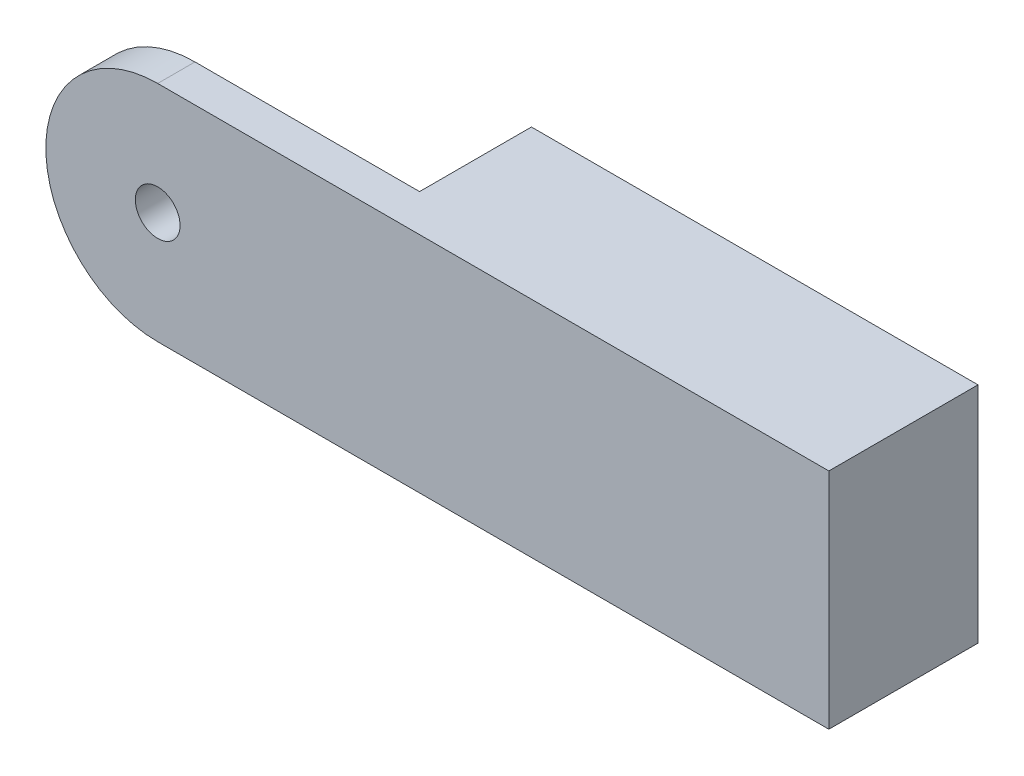
ISO-10303-21;
HEADER;
FILE_DESCRIPTION(('STEP AP214'),'2;1');
FILE_NAME('part.step','',(''),(''),'','','');
FILE_SCHEMA(('AUTOMOTIVE_DESIGN { 1 0 10303 214 1 1 1 1 }'));
ENDSEC;
DATA;
#1=APPLICATION_CONTEXT('core data for automotive mechanical design processes');
#2=APPLICATION_PROTOCOL_DEFINITION('international standard','automotive_design',2000,#1);
#3=PRODUCT_CONTEXT('',#1,'mechanical');
#4=PRODUCT('Part','Part','',(#3));
#5=PRODUCT_RELATED_PRODUCT_CATEGORY('part','',(#4));
#6=PRODUCT_DEFINITION_FORMATION('','',#4);
#7=PRODUCT_DEFINITION_CONTEXT('part definition',#1,'design');
#8=PRODUCT_DEFINITION('design','',#6,#7);
#9=PRODUCT_DEFINITION_SHAPE('','',#8);
#10=(LENGTH_UNIT() NAMED_UNIT(*) SI_UNIT(.MILLI.,.METRE.));
#11=(NAMED_UNIT(*) PLANE_ANGLE_UNIT() SI_UNIT($,.RADIAN.));
#12=(NAMED_UNIT(*) SI_UNIT($,.STERADIAN.) SOLID_ANGLE_UNIT());
#13=UNCERTAINTY_MEASURE_WITH_UNIT(LENGTH_MEASURE(1.E-05),#10,'distance_accuracy_value','');
#14=(GEOMETRIC_REPRESENTATION_CONTEXT(3) GLOBAL_UNCERTAINTY_ASSIGNED_CONTEXT((#13)) GLOBAL_UNIT_ASSIGNED_CONTEXT((#10,
#11,#12)) REPRESENTATION_CONTEXT('',''));
#15=CARTESIAN_POINT('',(0.,0.,0.));
#16=DIRECTION('',(0.,0.,1.));
#17=DIRECTION('',(1.,0.,0.));
#18=AXIS2_PLACEMENT_3D('',#15,#16,#17);
#19=CARTESIAN_POINT('',(-45.,0.,20.));
#20=DIRECTION('',(0.,0.,-1.));
#21=DIRECTION('',(-1.,0.,0.));
#22=AXIS2_PLACEMENT_3D('',#19,#20,#21);
#23=CYLINDRICAL_SURFACE('',#22,15.);
#24=CARTESIAN_POINT('',(-45.,0.,15.));
#25=DIRECTION('',(0.,0.,-1.));
#26=DIRECTION('',(-1.,0.,0.));
#27=AXIS2_PLACEMENT_3D('',#24,#25,#26);
#28=CIRCLE('',#27,15.);
#29=CARTESIAN_POINT('',(-45.,-15.,15.));
#30=VERTEX_POINT('',#29);
#31=CARTESIAN_POINT('',(-45.,15.,15.));
#32=VERTEX_POINT('',#31);
#33=EDGE_CURVE('E130',#30,#32,#28,.T.);
#34=ORIENTED_EDGE('',*,*,#33,.F.);
#35=DIRECTION('',(0.,0.,-1.));
#36=VECTOR('',#35,1.);
#37=CARTESIAN_POINT('',(-45.,-15.,20.));
#38=LINE('',#37,#36);
#39=CARTESIAN_POINT('',(-45.,-15.,20.));
#40=VERTEX_POINT('',#39);
#41=EDGE_CURVE('E103',#40,#30,#38,.T.);
#42=ORIENTED_EDGE('',*,*,#41,.F.);
#43=CARTESIAN_POINT('',(-45.,0.,20.));
#44=DIRECTION('',(0.,0.,1.));
#45=DIRECTION('',(1.,0.,0.));
#46=AXIS2_PLACEMENT_3D('',#43,#44,#45);
#47=CIRCLE('',#46,15.);
#48=CARTESIAN_POINT('',(-45.,15.,20.));
#49=VERTEX_POINT('',#48);
#50=EDGE_CURVE('E89',#49,#40,#47,.T.);
#51=ORIENTED_EDGE('',*,*,#50,.F.);
#52=DIRECTION('',(0.,0.,-1.));
#53=VECTOR('',#52,1.);
#54=CARTESIAN_POINT('',(-45.,15.,20.));
#55=LINE('',#54,#53);
#56=EDGE_CURVE('E46',#49,#32,#55,.T.);
#57=ORIENTED_EDGE('',*,*,#56,.T.);
#58=EDGE_LOOP('',(#34,#42,#51,#57));
#59=FACE_BOUND('',#58,.T.);
#60=ADVANCED_FACE('F36',(#59),#23,.T.);
#61=CARTESIAN_POINT('',(-45.,0.,20.));
#62=DIRECTION('',(0.,0.,-1.));
#63=DIRECTION('',(-1.,0.,0.));
#64=AXIS2_PLACEMENT_3D('',#61,#62,#63);
#65=CYLINDRICAL_SURFACE('',#64,3.);
#66=CARTESIAN_POINT('',(-45.,0.,20.));
#67=DIRECTION('',(0.,0.,1.));
#68=DIRECTION('',(1.,0.,0.));
#69=AXIS2_PLACEMENT_3D('',#66,#67,#68);
#70=CIRCLE('',#69,3.);
#71=CARTESIAN_POINT('',(-42.,0.,20.));
#72=VERTEX_POINT('',#71);
#73=EDGE_CURVE('E114',#72,#72,#70,.T.);
#74=ORIENTED_EDGE('',*,*,#73,.T.);
#75=EDGE_LOOP('',(#74));
#76=FACE_BOUND('',#75,.T.);
#77=CARTESIAN_POINT('',(-45.,0.,15.));
#78=DIRECTION('',(0.,0.,-1.));
#79=DIRECTION('',(-1.,0.,0.));
#80=AXIS2_PLACEMENT_3D('',#77,#78,#79);
#81=CIRCLE('',#80,3.);
#82=CARTESIAN_POINT('',(-48.,0.,15.));
#83=VERTEX_POINT('',#82);
#84=EDGE_CURVE('E40',#83,#83,#81,.T.);
#85=ORIENTED_EDGE('',*,*,#84,.T.);
#86=EDGE_LOOP('',(#85));
#87=FACE_BOUND('',#86,.T.);
#88=ADVANCED_FACE('F159',(#76,#87),#65,.F.);
#89=CARTESIAN_POINT('',(-45.,0.,20.));
#90=DIRECTION('',(0.,0.,1.));
#91=DIRECTION('',(1.,0.,0.));
#92=AXIS2_PLACEMENT_3D('',#89,#90,#91);
#93=PLANE('',#92);
#94=DIRECTION('',(0.,1.,0.));
#95=VECTOR('',#94,1.);
#96=CARTESIAN_POINT('',(45.,15.,20.));
#97=LINE('',#96,#95);
#98=CARTESIAN_POINT('',(45.,-15.,20.));
#99=VERTEX_POINT('',#98);
#100=CARTESIAN_POINT('',(45.,15.,20.));
#101=VERTEX_POINT('',#100);
#102=EDGE_CURVE('E92',#99,#101,#97,.T.);
#103=ORIENTED_EDGE('',*,*,#102,.T.);
#104=DIRECTION('',(-1.,0.,0.));
#105=VECTOR('',#104,1.);
#106=CARTESIAN_POINT('',(-45.,15.,20.));
#107=LINE('',#106,#105);
#108=EDGE_CURVE('E84',#101,#49,#107,.T.);
#109=ORIENTED_EDGE('',*,*,#108,.T.);
#110=ORIENTED_EDGE('',*,*,#50,.T.);
#111=DIRECTION('',(1.,0.,0.));
#112=VECTOR('',#111,1.);
#113=CARTESIAN_POINT('',(-45.,-15.,20.));
#114=LINE('',#113,#112);
#115=EDGE_CURVE('E54',#40,#99,#114,.T.);
#116=ORIENTED_EDGE('',*,*,#115,.T.);
#117=EDGE_LOOP('',(#103,#109,#110,#116));
#118=FACE_BOUND('',#117,.T.);
#119=ORIENTED_EDGE('',*,*,#73,.F.);
#120=EDGE_LOOP('',(#119));
#121=FACE_BOUND('',#120,.T.);
#122=ADVANCED_FACE('F86',(#118,#121),#93,.T.);
#123=CARTESIAN_POINT('',(-45.,0.,0.));
#124=DIRECTION('',(0.,0.,1.));
#125=DIRECTION('',(1.,0.,0.));
#126=AXIS2_PLACEMENT_3D('',#123,#124,#125);
#127=PLANE('',#126);
#128=DIRECTION('',(1.,0.,0.));
#129=VECTOR('',#128,1.);
#130=CARTESIAN_POINT('',(-45.,-15.,0.));
#131=LINE('',#130,#129);
#132=CARTESIAN_POINT('',(-14.8840247808136,-15.,0.));
#133=VERTEX_POINT('',#132);
#134=CARTESIAN_POINT('',(45.,-15.,0.));
#135=VERTEX_POINT('',#134);
#136=EDGE_CURVE('E116',#133,#135,#131,.T.);
#137=ORIENTED_EDGE('',*,*,#136,.F.);
#138=DIRECTION('',(0.,1.,0.));
#139=VECTOR('',#138,1.);
#140=CARTESIAN_POINT('',(-14.8840247808136,15.,0.));
#141=LINE('',#140,#139);
#142=CARTESIAN_POINT('',(-14.8840247808136,15.,0.));
#143=VERTEX_POINT('',#142);
#144=EDGE_CURVE('E137',#133,#143,#141,.T.);
#145=ORIENTED_EDGE('',*,*,#144,.T.);
#146=DIRECTION('',(-1.,0.,0.));
#147=VECTOR('',#146,1.);
#148=CARTESIAN_POINT('',(-45.,15.,0.));
#149=LINE('',#148,#147);
#150=CARTESIAN_POINT('',(45.,15.,0.));
#151=VERTEX_POINT('',#150);
#152=EDGE_CURVE('E66',#151,#143,#149,.T.);
#153=ORIENTED_EDGE('',*,*,#152,.F.);
#154=DIRECTION('',(0.,1.,0.));
#155=VECTOR('',#154,1.);
#156=CARTESIAN_POINT('',(45.,15.,0.));
#157=LINE('',#156,#155);
#158=EDGE_CURVE('E111',#135,#151,#157,.T.);
#159=ORIENTED_EDGE('',*,*,#158,.F.);
#160=EDGE_LOOP('',(#137,#145,#153,#159));
#161=FACE_BOUND('',#160,.T.);
#162=ADVANCED_FACE('F144',(#161),#127,.F.);
#163=CARTESIAN_POINT('',(45.,15.,20.));
#164=DIRECTION('',(-1.,0.,0.));
#165=DIRECTION('',(0.,0.,1.));
#166=AXIS2_PLACEMENT_3D('',#163,#164,#165);
#167=PLANE('',#166);
#168=ORIENTED_EDGE('',*,*,#158,.T.);
#169=DIRECTION('',(0.,0.,-1.));
#170=VECTOR('',#169,1.);
#171=CARTESIAN_POINT('',(45.,15.,20.));
#172=LINE('',#171,#170);
#173=EDGE_CURVE('E11',#101,#151,#172,.T.);
#174=ORIENTED_EDGE('',*,*,#173,.F.);
#175=ORIENTED_EDGE('',*,*,#102,.F.);
#176=DIRECTION('',(0.,0.,-1.));
#177=VECTOR('',#176,1.);
#178=CARTESIAN_POINT('',(45.,-15.,20.));
#179=LINE('',#178,#177);
#180=EDGE_CURVE('E107',#99,#135,#179,.T.);
#181=ORIENTED_EDGE('',*,*,#180,.T.);
#182=EDGE_LOOP('',(#168,#174,#175,#181));
#183=FACE_BOUND('',#182,.T.);
#184=ADVANCED_FACE('F38',(#183),#167,.F.);
#185=CARTESIAN_POINT('',(-45.,15.,20.));
#186=DIRECTION('',(0.,-1.,0.));
#187=DIRECTION('',(0.,0.,-1.));
#188=AXIS2_PLACEMENT_3D('',#185,#186,#187);
#189=PLANE('',#188);
#190=ORIENTED_EDGE('',*,*,#152,.T.);
#191=DIRECTION('',(0.,0.,1.));
#192=VECTOR('',#191,1.);
#193=CARTESIAN_POINT('',(-14.8840247808136,15.,0.));
#194=LINE('',#193,#192);
#195=CARTESIAN_POINT('',(-14.8840247808136,15.,15.));
#196=VERTEX_POINT('',#195);
#197=EDGE_CURVE('E135',#143,#196,#194,.T.);
#198=ORIENTED_EDGE('',*,*,#197,.T.);
#199=DIRECTION('',(-1.,0.,0.));
#200=VECTOR('',#199,1.);
#201=CARTESIAN_POINT('',(-29.6441469032038,15.,15.));
#202=LINE('',#201,#200);
#203=EDGE_CURVE('E101',#196,#32,#202,.T.);
#204=ORIENTED_EDGE('',*,*,#203,.T.);
#205=ORIENTED_EDGE('',*,*,#56,.F.);
#206=ORIENTED_EDGE('',*,*,#108,.F.);
#207=ORIENTED_EDGE('',*,*,#173,.T.);
#208=EDGE_LOOP('',(#190,#198,#204,#205,#206,#207));
#209=FACE_BOUND('',#208,.T.);
#210=ADVANCED_FACE('F98',(#209),#189,.F.);
#211=CARTESIAN_POINT('',(-45.,-15.,20.));
#212=DIRECTION('',(0.,1.,0.));
#213=DIRECTION('',(0.,0.,1.));
#214=AXIS2_PLACEMENT_3D('',#211,#212,#213);
#215=PLANE('',#214);
#216=DIRECTION('',(1.,0.,0.));
#217=VECTOR('',#216,1.);
#218=CARTESIAN_POINT('',(-29.6441469032038,-15.,15.));
#219=LINE('',#218,#217);
#220=CARTESIAN_POINT('',(-14.8840247808136,-15.,15.));
#221=VERTEX_POINT('',#220);
#222=EDGE_CURVE('E76',#30,#221,#219,.T.);
#223=ORIENTED_EDGE('',*,*,#222,.T.);
#224=DIRECTION('',(0.,0.,1.));
#225=VECTOR('',#224,1.);
#226=CARTESIAN_POINT('',(-14.8840247808136,-15.,0.));
#227=LINE('',#226,#225);
#228=EDGE_CURVE('E134',#133,#221,#227,.T.);
#229=ORIENTED_EDGE('',*,*,#228,.F.);
#230=ORIENTED_EDGE('',*,*,#136,.T.);
#231=ORIENTED_EDGE('',*,*,#180,.F.);
#232=ORIENTED_EDGE('',*,*,#115,.F.);
#233=ORIENTED_EDGE('',*,*,#41,.T.);
#234=EDGE_LOOP('',(#223,#229,#230,#231,#232,#233));
#235=FACE_BOUND('',#234,.T.);
#236=ADVANCED_FACE('F121',(#235),#215,.F.);
#237=CARTESIAN_POINT('',(0.,0.,15.));
#238=DIRECTION('',(0.,0.,-1.));
#239=DIRECTION('',(-1.,0.,0.));
#240=AXIS2_PLACEMENT_3D('',#237,#238,#239);
#241=PLANE('',#240);
#242=ORIENTED_EDGE('',*,*,#33,.T.);
#243=ORIENTED_EDGE('',*,*,#203,.F.);
#244=DIRECTION('',(0.,1.,0.));
#245=VECTOR('',#244,1.);
#246=CARTESIAN_POINT('',(-14.8840247808136,15.,15.));
#247=LINE('',#246,#245);
#248=EDGE_CURVE('E139',#221,#196,#247,.T.);
#249=ORIENTED_EDGE('',*,*,#248,.F.);
#250=ORIENTED_EDGE('',*,*,#222,.F.);
#251=EDGE_LOOP('',(#242,#243,#249,#250));
#252=FACE_BOUND('',#251,.T.);
#253=ORIENTED_EDGE('',*,*,#84,.F.);
#254=EDGE_LOOP('',(#253));
#255=FACE_BOUND('',#254,.T.);
#256=ADVANCED_FACE('F151',(#252,#255),#241,.T.);
#257=CARTESIAN_POINT('',(-14.8840247808136,15.,0.));
#258=DIRECTION('',(1.,0.,0.));
#259=DIRECTION('',(0.,1.,0.));
#260=AXIS2_PLACEMENT_3D('',#257,#258,#259);
#261=PLANE('',#260);
#262=ORIENTED_EDGE('',*,*,#248,.T.);
#263=ORIENTED_EDGE('',*,*,#197,.F.);
#264=ORIENTED_EDGE('',*,*,#144,.F.);
#265=ORIENTED_EDGE('',*,*,#228,.T.);
#266=EDGE_LOOP('',(#262,#263,#264,#265));
#267=FACE_BOUND('',#266,.T.);
#268=ADVANCED_FACE('F150',(#267),#261,.F.);
#269=CLOSED_SHELL('',(#60,#88,#122,#162,#184,#210,#236,#256,#268));
#270=MANIFOLD_SOLID_BREP('B2',#269);
#271=ADVANCED_BREP_SHAPE_REPRESENTATION('',(#18,#270),#14);
#272=SHAPE_DEFINITION_REPRESENTATION(#9,#271);
ENDSEC;
END-ISO-10303-21;
